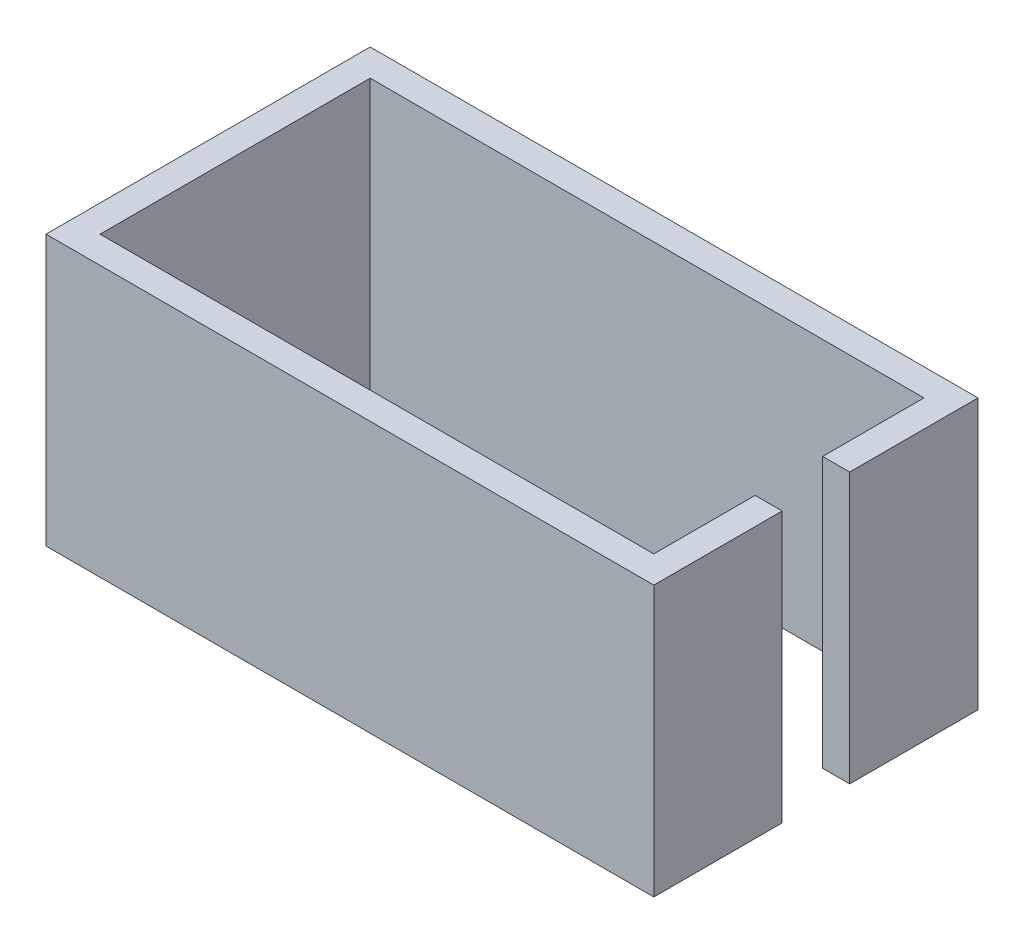
ISO-10303-21;
HEADER;
FILE_DESCRIPTION(('STEP AP214'),'2;1');
FILE_NAME('part.step','',(''),(''),'','','');
FILE_SCHEMA(('AUTOMOTIVE_DESIGN { 1 0 10303 214 1 1 1 1 }'));
ENDSEC;
DATA;
#1=APPLICATION_CONTEXT('core data for automotive mechanical design processes');
#2=APPLICATION_PROTOCOL_DEFINITION('international standard','automotive_design',2000,#1);
#3=PRODUCT_CONTEXT('',#1,'mechanical');
#4=PRODUCT('Part','Part','',(#3));
#5=PRODUCT_RELATED_PRODUCT_CATEGORY('part','',(#4));
#6=PRODUCT_DEFINITION_FORMATION('','',#4);
#7=PRODUCT_DEFINITION_CONTEXT('part definition',#1,'design');
#8=PRODUCT_DEFINITION('design','',#6,#7);
#9=PRODUCT_DEFINITION_SHAPE('','',#8);
#10=(LENGTH_UNIT() NAMED_UNIT(*) SI_UNIT(.MILLI.,.METRE.));
#11=(NAMED_UNIT(*) PLANE_ANGLE_UNIT() SI_UNIT($,.RADIAN.));
#12=(NAMED_UNIT(*) SI_UNIT($,.STERADIAN.) SOLID_ANGLE_UNIT());
#13=UNCERTAINTY_MEASURE_WITH_UNIT(LENGTH_MEASURE(1.E-05),#10,'distance_accuracy_value','');
#14=(GEOMETRIC_REPRESENTATION_CONTEXT(3) GLOBAL_UNCERTAINTY_ASSIGNED_CONTEXT((#13)) GLOBAL_UNIT_ASSIGNED_CONTEXT((#10,
#11,#12)) REPRESENTATION_CONTEXT('',''));
#15=CARTESIAN_POINT('',(0.,0.,0.));
#16=DIRECTION('',(0.,0.,1.));
#17=DIRECTION('',(1.,0.,0.));
#18=AXIS2_PLACEMENT_3D('',#15,#16,#17);
#19=CARTESIAN_POINT('',(11.25,10.,6.));
#20=DIRECTION('',(-1.,0.,0.));
#21=DIRECTION('',(0.,0.,1.));
#22=AXIS2_PLACEMENT_3D('',#19,#20,#21);
#23=PLANE('',#22);
#24=DIRECTION('',(0.,0.,-1.));
#25=VECTOR('',#24,1.);
#26=CARTESIAN_POINT('',(11.25,0.,6.));
#27=LINE('',#26,#25);
#28=CARTESIAN_POINT('',(11.25,0.,6.));
#29=VERTEX_POINT('',#28);
#30=CARTESIAN_POINT('',(11.25,0.,1.25));
#31=VERTEX_POINT('',#30);
#32=EDGE_CURVE('E137',#29,#31,#27,.T.);
#33=ORIENTED_EDGE('',*,*,#32,.T.);
#34=DIRECTION('',(0.,-1.,0.));
#35=VECTOR('',#34,1.);
#36=CARTESIAN_POINT('',(11.25,0.,1.25));
#37=LINE('',#36,#35);
#38=CARTESIAN_POINT('',(11.25,10.,1.25));
#39=VERTEX_POINT('',#38);
#40=EDGE_CURVE('E123',#39,#31,#37,.T.);
#41=ORIENTED_EDGE('',*,*,#40,.F.);
#42=DIRECTION('',(0.,0.,-1.));
#43=VECTOR('',#42,1.);
#44=CARTESIAN_POINT('',(11.25,10.,6.));
#45=LINE('',#44,#43);
#46=CARTESIAN_POINT('',(11.25,10.,6.));
#47=VERTEX_POINT('',#46);
#48=EDGE_CURVE('E208',#47,#39,#45,.T.);
#49=ORIENTED_EDGE('',*,*,#48,.F.);
#50=DIRECTION('',(0.,-1.,0.));
#51=VECTOR('',#50,1.);
#52=CARTESIAN_POINT('',(11.25,10.,6.));
#53=LINE('',#52,#51);
#54=EDGE_CURVE('E144',#47,#29,#53,.T.);
#55=ORIENTED_EDGE('',*,*,#54,.T.);
#56=EDGE_LOOP('',(#33,#41,#49,#55));
#57=FACE_BOUND('',#56,.T.);
#58=ADVANCED_FACE('F37',(#57),#23,.F.);
#59=CARTESIAN_POINT('',(10.25,10.,5.));
#60=DIRECTION('',(-1.,0.,0.));
#61=DIRECTION('',(0.,0.,1.));
#62=AXIS2_PLACEMENT_3D('',#59,#60,#61);
#63=PLANE('',#62);
#64=DIRECTION('',(0.,1.,0.));
#65=VECTOR('',#64,1.);
#66=CARTESIAN_POINT('',(10.25,10.,1.25));
#67=LINE('',#66,#65);
#68=CARTESIAN_POINT('',(10.25,0.,1.25));
#69=VERTEX_POINT('',#68);
#70=CARTESIAN_POINT('',(10.25,10.,1.25));
#71=VERTEX_POINT('',#70);
#72=EDGE_CURVE('E11',#69,#71,#67,.T.);
#73=ORIENTED_EDGE('',*,*,#72,.F.);
#74=DIRECTION('',(0.,0.,-1.));
#75=VECTOR('',#74,1.);
#76=CARTESIAN_POINT('',(10.25,0.,5.));
#77=LINE('',#76,#75);
#78=CARTESIAN_POINT('',(10.25,0.,5.));
#79=VERTEX_POINT('',#78);
#80=EDGE_CURVE('E139',#79,#69,#77,.T.);
#81=ORIENTED_EDGE('',*,*,#80,.F.);
#82=DIRECTION('',(0.,-1.,0.));
#83=VECTOR('',#82,1.);
#84=CARTESIAN_POINT('',(10.25,10.,5.));
#85=LINE('',#84,#83);
#86=CARTESIAN_POINT('',(10.25,10.,5.));
#87=VERTEX_POINT('',#86);
#88=EDGE_CURVE('E194',#87,#79,#85,.T.);
#89=ORIENTED_EDGE('',*,*,#88,.F.);
#90=DIRECTION('',(0.,0.,-1.));
#91=VECTOR('',#90,1.);
#92=CARTESIAN_POINT('',(10.25,10.,5.));
#93=LINE('',#92,#91);
#94=EDGE_CURVE('E230',#87,#71,#93,.T.);
#95=ORIENTED_EDGE('',*,*,#94,.T.);
#96=EDGE_LOOP('',(#73,#81,#89,#95));
#97=FACE_BOUND('',#96,.T.);
#98=ADVANCED_FACE('F246',(#97),#63,.T.);
#99=CARTESIAN_POINT('',(0.,10.,0.));
#100=DIRECTION('',(0.,-1.,0.));
#101=DIRECTION('',(0.,0.,-1.));
#102=AXIS2_PLACEMENT_3D('',#99,#100,#101);
#103=PLANE('',#102);
#104=ORIENTED_EDGE('',*,*,#48,.T.);
#105=DIRECTION('',(1.,0.,0.));
#106=VECTOR('',#105,1.);
#107=CARTESIAN_POINT('',(6.25,10.,1.25));
#108=LINE('',#107,#106);
#109=EDGE_CURVE('E126',#71,#39,#108,.T.);
#110=ORIENTED_EDGE('',*,*,#109,.F.);
#111=ORIENTED_EDGE('',*,*,#94,.F.);
#112=DIRECTION('',(1.,0.,0.));
#113=VECTOR('',#112,1.);
#114=CARTESIAN_POINT('',(-10.25,10.,5.));
#115=LINE('',#114,#113);
#116=CARTESIAN_POINT('',(-10.25,10.,5.));
#117=VERTEX_POINT('',#116);
#118=EDGE_CURVE('E185',#117,#87,#115,.T.);
#119=ORIENTED_EDGE('',*,*,#118,.F.);
#120=DIRECTION('',(0.,0.,1.));
#121=VECTOR('',#120,1.);
#122=CARTESIAN_POINT('',(-10.25,10.,5.));
#123=LINE('',#122,#121);
#124=CARTESIAN_POINT('',(-10.25,10.,-5.));
#125=VERTEX_POINT('',#124);
#126=EDGE_CURVE('E234',#125,#117,#123,.T.);
#127=ORIENTED_EDGE('',*,*,#126,.F.);
#128=DIRECTION('',(-1.,0.,0.));
#129=VECTOR('',#128,1.);
#130=CARTESIAN_POINT('',(-10.25,10.,-5.));
#131=LINE('',#130,#129);
#132=CARTESIAN_POINT('',(10.25,10.,-5.));
#133=VERTEX_POINT('',#132);
#134=EDGE_CURVE('E233',#133,#125,#131,.T.);
#135=ORIENTED_EDGE('',*,*,#134,.F.);
#136=CARTESIAN_POINT('',(10.25,10.,-1.25));
#137=VERTEX_POINT('',#136);
#138=EDGE_CURVE('E193',#137,#133,#93,.T.);
#139=ORIENTED_EDGE('',*,*,#138,.F.);
#140=DIRECTION('',(1.,0.,0.));
#141=VECTOR('',#140,1.);
#142=CARTESIAN_POINT('',(6.25,10.,-1.25));
#143=LINE('',#142,#141);
#144=CARTESIAN_POINT('',(11.25,10.,-1.25));
#145=VERTEX_POINT('',#144);
#146=EDGE_CURVE('E52',#137,#145,#143,.T.);
#147=ORIENTED_EDGE('',*,*,#146,.T.);
#148=CARTESIAN_POINT('',(11.25,10.,-6.));
#149=VERTEX_POINT('',#148);
#150=EDGE_CURVE('E207',#145,#149,#45,.T.);
#151=ORIENTED_EDGE('',*,*,#150,.T.);
#152=DIRECTION('',(-1.,0.,0.));
#153=VECTOR('',#152,1.);
#154=CARTESIAN_POINT('',(-11.25,10.,-6.));
#155=LINE('',#154,#153);
#156=CARTESIAN_POINT('',(-11.25,10.,-6.));
#157=VERTEX_POINT('',#156);
#158=EDGE_CURVE('E158',#149,#157,#155,.T.);
#159=ORIENTED_EDGE('',*,*,#158,.T.);
#160=DIRECTION('',(0.,0.,1.));
#161=VECTOR('',#160,1.);
#162=CARTESIAN_POINT('',(-11.25,10.,6.));
#163=LINE('',#162,#161);
#164=CARTESIAN_POINT('',(-11.25,10.,6.));
#165=VERTEX_POINT('',#164);
#166=EDGE_CURVE('E148',#157,#165,#163,.T.);
#167=ORIENTED_EDGE('',*,*,#166,.T.);
#168=DIRECTION('',(1.,0.,0.));
#169=VECTOR('',#168,1.);
#170=CARTESIAN_POINT('',(-11.25,10.,6.));
#171=LINE('',#170,#169);
#172=EDGE_CURVE('E205',#165,#47,#171,.T.);
#173=ORIENTED_EDGE('',*,*,#172,.T.);
#174=EDGE_LOOP('',(#104,#110,#111,#119,#127,#135,#139,#147,#151,#159,#167,#173));
#175=FACE_BOUND('',#174,.T.);
#176=ADVANCED_FACE('F223',(#175),#103,.F.);
#177=CARTESIAN_POINT('',(0.,0.,0.));
#178=DIRECTION('',(0.,-1.,0.));
#179=DIRECTION('',(0.,0.,-1.));
#180=AXIS2_PLACEMENT_3D('',#177,#178,#179);
#181=PLANE('',#180);
#182=DIRECTION('',(1.,0.,0.));
#183=VECTOR('',#182,1.);
#184=CARTESIAN_POINT('',(6.25,0.,1.25));
#185=LINE('',#184,#183);
#186=EDGE_CURVE('E59',#69,#31,#185,.T.);
#187=ORIENTED_EDGE('',*,*,#186,.T.);
#188=ORIENTED_EDGE('',*,*,#32,.F.);
#189=DIRECTION('',(1.,0.,0.));
#190=VECTOR('',#189,1.);
#191=CARTESIAN_POINT('',(-11.25,0.,6.));
#192=LINE('',#191,#190);
#193=CARTESIAN_POINT('',(-11.25,0.,6.));
#194=VERTEX_POINT('',#193);
#195=EDGE_CURVE('E150',#194,#29,#192,.T.);
#196=ORIENTED_EDGE('',*,*,#195,.F.);
#197=DIRECTION('',(0.,0.,1.));
#198=VECTOR('',#197,1.);
#199=CARTESIAN_POINT('',(-11.25,0.,6.));
#200=LINE('',#199,#198);
#201=CARTESIAN_POINT('',(-11.25,0.,-6.));
#202=VERTEX_POINT('',#201);
#203=EDGE_CURVE('E202',#202,#194,#200,.T.);
#204=ORIENTED_EDGE('',*,*,#203,.F.);
#205=DIRECTION('',(-1.,0.,0.));
#206=VECTOR('',#205,1.);
#207=CARTESIAN_POINT('',(-11.25,0.,-6.));
#208=LINE('',#207,#206);
#209=CARTESIAN_POINT('',(11.25,0.,-6.));
#210=VERTEX_POINT('',#209);
#211=EDGE_CURVE('E145',#210,#202,#208,.T.);
#212=ORIENTED_EDGE('',*,*,#211,.F.);
#213=CARTESIAN_POINT('',(11.25,0.,-1.25));
#214=VERTEX_POINT('',#213);
#215=EDGE_CURVE('E146',#214,#210,#27,.T.);
#216=ORIENTED_EDGE('',*,*,#215,.F.);
#217=DIRECTION('',(1.,0.,0.));
#218=VECTOR('',#217,1.);
#219=CARTESIAN_POINT('',(6.25,0.,-1.25));
#220=LINE('',#219,#218);
#221=CARTESIAN_POINT('',(10.25,0.,-1.25));
#222=VERTEX_POINT('',#221);
#223=EDGE_CURVE('E140',#222,#214,#220,.T.);
#224=ORIENTED_EDGE('',*,*,#223,.F.);
#225=CARTESIAN_POINT('',(10.25,0.,-5.));
#226=VERTEX_POINT('',#225);
#227=EDGE_CURVE('E172',#222,#226,#77,.T.);
#228=ORIENTED_EDGE('',*,*,#227,.T.);
#229=DIRECTION('',(-1.,0.,0.));
#230=VECTOR('',#229,1.);
#231=CARTESIAN_POINT('',(-10.25,0.,-5.));
#232=LINE('',#231,#230);
#233=CARTESIAN_POINT('',(-10.25,0.,-5.));
#234=VERTEX_POINT('',#233);
#235=EDGE_CURVE('E181',#226,#234,#232,.T.);
#236=ORIENTED_EDGE('',*,*,#235,.T.);
#237=DIRECTION('',(0.,0.,1.));
#238=VECTOR('',#237,1.);
#239=CARTESIAN_POINT('',(-10.25,0.,5.));
#240=LINE('',#239,#238);
#241=CARTESIAN_POINT('',(-10.25,0.,5.));
#242=VERTEX_POINT('',#241);
#243=EDGE_CURVE('E188',#234,#242,#240,.T.);
#244=ORIENTED_EDGE('',*,*,#243,.T.);
#245=DIRECTION('',(1.,0.,0.));
#246=VECTOR('',#245,1.);
#247=CARTESIAN_POINT('',(-10.25,0.,5.));
#248=LINE('',#247,#246);
#249=EDGE_CURVE('E191',#242,#79,#248,.T.);
#250=ORIENTED_EDGE('',*,*,#249,.T.);
#251=ORIENTED_EDGE('',*,*,#80,.T.);
#252=EDGE_LOOP('',(#187,#188,#196,#204,#212,#216,#224,#228,#236,#244,#250,#251));
#253=FACE_BOUND('',#252,.T.);
#254=ADVANCED_FACE('F136',(#253),#181,.T.);
#255=CARTESIAN_POINT('',(-11.25,10.,6.));
#256=DIRECTION('',(1.,0.,0.));
#257=DIRECTION('',(0.,0.,-1.));
#258=AXIS2_PLACEMENT_3D('',#255,#256,#257);
#259=PLANE('',#258);
#260=ORIENTED_EDGE('',*,*,#203,.T.);
#261=DIRECTION('',(0.,-1.,0.));
#262=VECTOR('',#261,1.);
#263=CARTESIAN_POINT('',(-11.25,10.,6.));
#264=LINE('',#263,#262);
#265=EDGE_CURVE('E162',#165,#194,#264,.T.);
#266=ORIENTED_EDGE('',*,*,#265,.F.);
#267=ORIENTED_EDGE('',*,*,#166,.F.);
#268=DIRECTION('',(0.,-1.,0.));
#269=VECTOR('',#268,1.);
#270=CARTESIAN_POINT('',(-11.25,10.,-6.));
#271=LINE('',#270,#269);
#272=EDGE_CURVE('E154',#157,#202,#271,.T.);
#273=ORIENTED_EDGE('',*,*,#272,.T.);
#274=EDGE_LOOP('',(#260,#266,#267,#273));
#275=FACE_BOUND('',#274,.T.);
#276=ADVANCED_FACE('F39',(#275),#259,.F.);
#277=CARTESIAN_POINT('',(-11.25,10.,6.));
#278=DIRECTION('',(0.,0.,-1.));
#279=DIRECTION('',(-1.,0.,0.));
#280=AXIS2_PLACEMENT_3D('',#277,#278,#279);
#281=PLANE('',#280);
#282=ORIENTED_EDGE('',*,*,#195,.T.);
#283=ORIENTED_EDGE('',*,*,#54,.F.);
#284=ORIENTED_EDGE('',*,*,#172,.F.);
#285=ORIENTED_EDGE('',*,*,#265,.T.);
#286=EDGE_LOOP('',(#282,#283,#284,#285));
#287=FACE_BOUND('',#286,.T.);
#288=ADVANCED_FACE('F215',(#287),#281,.F.);
#289=ORIENTED_EDGE('',*,*,#150,.F.);
#290=DIRECTION('',(0.,1.,0.));
#291=VECTOR('',#290,1.);
#292=CARTESIAN_POINT('',(11.25,0.,-1.25));
#293=LINE('',#292,#291);
#294=EDGE_CURVE('E131',#214,#145,#293,.T.);
#295=ORIENTED_EDGE('',*,*,#294,.F.);
#296=ORIENTED_EDGE('',*,*,#215,.T.);
#297=DIRECTION('',(0.,-1.,0.));
#298=VECTOR('',#297,1.);
#299=CARTESIAN_POINT('',(11.25,10.,-6.));
#300=LINE('',#299,#298);
#301=EDGE_CURVE('E157',#149,#210,#300,.T.);
#302=ORIENTED_EDGE('',*,*,#301,.F.);
#303=EDGE_LOOP('',(#289,#295,#296,#302));
#304=FACE_BOUND('',#303,.T.);
#305=ADVANCED_FACE('F226',(#304),#23,.F.);
#306=CARTESIAN_POINT('',(-11.25,10.,-6.));
#307=DIRECTION('',(0.,0.,1.));
#308=DIRECTION('',(1.,0.,0.));
#309=AXIS2_PLACEMENT_3D('',#306,#307,#308);
#310=PLANE('',#309);
#311=ORIENTED_EDGE('',*,*,#211,.T.);
#312=ORIENTED_EDGE('',*,*,#272,.F.);
#313=ORIENTED_EDGE('',*,*,#158,.F.);
#314=ORIENTED_EDGE('',*,*,#301,.T.);
#315=EDGE_LOOP('',(#311,#312,#313,#314));
#316=FACE_BOUND('',#315,.T.);
#317=ADVANCED_FACE('F218',(#316),#310,.F.);
#318=DIRECTION('',(0.,-1.,0.));
#319=VECTOR('',#318,1.);
#320=CARTESIAN_POINT('',(10.25,10.,-1.25));
#321=LINE('',#320,#319);
#322=EDGE_CURVE('E45',#137,#222,#321,.T.);
#323=ORIENTED_EDGE('',*,*,#322,.F.);
#324=ORIENTED_EDGE('',*,*,#138,.T.);
#325=DIRECTION('',(0.,-1.,0.));
#326=VECTOR('',#325,1.);
#327=CARTESIAN_POINT('',(10.25,10.,-5.));
#328=LINE('',#327,#326);
#329=EDGE_CURVE('E179',#133,#226,#328,.T.);
#330=ORIENTED_EDGE('',*,*,#329,.T.);
#331=ORIENTED_EDGE('',*,*,#227,.F.);
#332=EDGE_LOOP('',(#323,#324,#330,#331));
#333=FACE_BOUND('',#332,.T.);
#334=ADVANCED_FACE('F177',(#333),#63,.T.);
#335=CARTESIAN_POINT('',(-10.25,10.,-5.));
#336=DIRECTION('',(0.,0.,1.));
#337=DIRECTION('',(1.,0.,0.));
#338=AXIS2_PLACEMENT_3D('',#335,#336,#337);
#339=PLANE('',#338);
#340=ORIENTED_EDGE('',*,*,#235,.F.);
#341=ORIENTED_EDGE('',*,*,#329,.F.);
#342=ORIENTED_EDGE('',*,*,#134,.T.);
#343=DIRECTION('',(0.,-1.,0.));
#344=VECTOR('',#343,1.);
#345=CARTESIAN_POINT('',(-10.25,10.,-5.));
#346=LINE('',#345,#344);
#347=EDGE_CURVE('E199',#125,#234,#346,.T.);
#348=ORIENTED_EDGE('',*,*,#347,.T.);
#349=EDGE_LOOP('',(#340,#341,#342,#348));
#350=FACE_BOUND('',#349,.T.);
#351=ADVANCED_FACE('F257',(#350),#339,.T.);
#352=CARTESIAN_POINT('',(-10.25,10.,5.));
#353=DIRECTION('',(1.,0.,0.));
#354=DIRECTION('',(0.,0.,-1.));
#355=AXIS2_PLACEMENT_3D('',#352,#353,#354);
#356=PLANE('',#355);
#357=ORIENTED_EDGE('',*,*,#243,.F.);
#358=ORIENTED_EDGE('',*,*,#347,.F.);
#359=ORIENTED_EDGE('',*,*,#126,.T.);
#360=DIRECTION('',(0.,-1.,0.));
#361=VECTOR('',#360,1.);
#362=CARTESIAN_POINT('',(-10.25,10.,5.));
#363=LINE('',#362,#361);
#364=EDGE_CURVE('E197',#117,#242,#363,.T.);
#365=ORIENTED_EDGE('',*,*,#364,.T.);
#366=EDGE_LOOP('',(#357,#358,#359,#365));
#367=FACE_BOUND('',#366,.T.);
#368=ADVANCED_FACE('F262',(#367),#356,.T.);
#369=CARTESIAN_POINT('',(-10.25,10.,5.));
#370=DIRECTION('',(0.,0.,-1.));
#371=DIRECTION('',(-1.,0.,0.));
#372=AXIS2_PLACEMENT_3D('',#369,#370,#371);
#373=PLANE('',#372);
#374=ORIENTED_EDGE('',*,*,#249,.F.);
#375=ORIENTED_EDGE('',*,*,#364,.F.);
#376=ORIENTED_EDGE('',*,*,#118,.T.);
#377=ORIENTED_EDGE('',*,*,#88,.T.);
#378=EDGE_LOOP('',(#374,#375,#376,#377));
#379=FACE_BOUND('',#378,.T.);
#380=ADVANCED_FACE('F243',(#379),#373,.T.);
#381=CARTESIAN_POINT('',(6.25,0.,-1.25));
#382=DIRECTION('',(0.,0.,-1.));
#383=DIRECTION('',(-1.,0.,0.));
#384=AXIS2_PLACEMENT_3D('',#381,#382,#383);
#385=PLANE('',#384);
#386=ORIENTED_EDGE('',*,*,#322,.T.);
#387=ORIENTED_EDGE('',*,*,#223,.T.);
#388=ORIENTED_EDGE('',*,*,#294,.T.);
#389=ORIENTED_EDGE('',*,*,#146,.F.);
#390=EDGE_LOOP('',(#386,#387,#388,#389));
#391=FACE_BOUND('',#390,.T.);
#392=ADVANCED_FACE('F165',(#391),#385,.F.);
#393=CARTESIAN_POINT('',(6.25,0.,1.25));
#394=DIRECTION('',(0.,0.,1.));
#395=DIRECTION('',(1.,0.,0.));
#396=AXIS2_PLACEMENT_3D('',#393,#394,#395);
#397=PLANE('',#396);
#398=ORIENTED_EDGE('',*,*,#72,.T.);
#399=ORIENTED_EDGE('',*,*,#109,.T.);
#400=ORIENTED_EDGE('',*,*,#40,.T.);
#401=ORIENTED_EDGE('',*,*,#186,.F.);
#402=EDGE_LOOP('',(#398,#399,#400,#401));
#403=FACE_BOUND('',#402,.T.);
#404=ADVANCED_FACE('F124',(#403),#397,.F.);
#405=CLOSED_SHELL('',(#58,#98,#176,#254,#276,#288,#305,#317,#334,#351,#368,#380,#392,#404));
#406=MANIFOLD_SOLID_BREP('B2',#405);
#407=ADVANCED_BREP_SHAPE_REPRESENTATION('',(#18,#406),#14);
#408=SHAPE_DEFINITION_REPRESENTATION(#9,#407);
ENDSEC;
END-ISO-10303-21;
